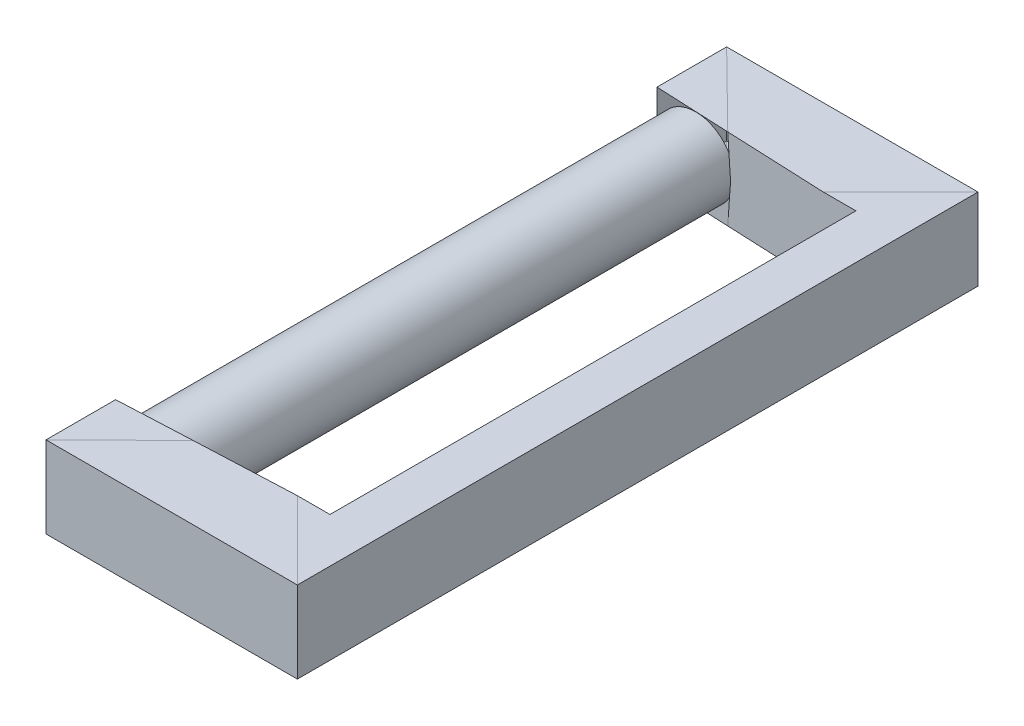
ISO-10303-21;
HEADER;
FILE_DESCRIPTION(('STEP AP214'),'2;1');
FILE_NAME('part.step','',(''),(''),'','','');
FILE_SCHEMA(('AUTOMOTIVE_DESIGN { 1 0 10303 214 1 1 1 1 }'));
ENDSEC;
DATA;
#1=APPLICATION_CONTEXT('core data for automotive mechanical design processes');
#2=APPLICATION_PROTOCOL_DEFINITION('international standard','automotive_design',2000,#1);
#3=PRODUCT_CONTEXT('',#1,'mechanical');
#4=PRODUCT('Part','Part','',(#3));
#5=PRODUCT_RELATED_PRODUCT_CATEGORY('part','',(#4));
#6=PRODUCT_DEFINITION_FORMATION('','',#4);
#7=PRODUCT_DEFINITION_CONTEXT('part definition',#1,'design');
#8=PRODUCT_DEFINITION('design','',#6,#7);
#9=PRODUCT_DEFINITION_SHAPE('','',#8);
#10=(LENGTH_UNIT() NAMED_UNIT(*) SI_UNIT(.MILLI.,.METRE.));
#11=(NAMED_UNIT(*) PLANE_ANGLE_UNIT() SI_UNIT($,.RADIAN.));
#12=(NAMED_UNIT(*) SI_UNIT($,.STERADIAN.) SOLID_ANGLE_UNIT());
#13=UNCERTAINTY_MEASURE_WITH_UNIT(LENGTH_MEASURE(1.E-05),#10,'distance_accuracy_value','');
#14=(GEOMETRIC_REPRESENTATION_CONTEXT(3) GLOBAL_UNCERTAINTY_ASSIGNED_CONTEXT((#13)) GLOBAL_UNIT_ASSIGNED_CONTEXT((#10,
#11,#12)) REPRESENTATION_CONTEXT('',''));
#15=CARTESIAN_POINT('',(0.,0.,0.));
#16=DIRECTION('',(0.,0.,1.));
#17=DIRECTION('',(1.,0.,0.));
#18=AXIS2_PLACEMENT_3D('',#15,#16,#17);
#19=CARTESIAN_POINT('',(0.,0.,3.5));
#20=DIRECTION('',(0.,0.,-1.));
#21=DIRECTION('',(-1.,0.,0.));
#22=AXIS2_PLACEMENT_3D('',#19,#20,#21);
#23=PLANE('',#22);
#24=CARTESIAN_POINT('',(0.,0.,3.5));
#25=DIRECTION('',(0.,0.,1.));
#26=DIRECTION('',(1.,0.,0.));
#27=AXIS2_PLACEMENT_3D('',#24,#25,#26);
#28=CIRCLE('',#27,0.5);
#29=CARTESIAN_POINT('',(0.5,0.,3.45));
#30=VERTEX_POINT('',#29);
#31=CARTESIAN_POINT('',(-0.5,0.,3.5));
#32=VERTEX_POINT('',#31);
#33=EDGE_CURVE('E11',#30,#32,#28,.T.);
#34=ORIENTED_EDGE('',*,*,#33,.T.);
#35=DIRECTION('',(0.,-1.,0.));
#36=VECTOR('',#35,1.);
#37=CARTESIAN_POINT('',(-0.5,-0.527056232971408,3.5));
#38=LINE('',#37,#36);
#39=CARTESIAN_POINT('',(-0.5,0.527056232971408,3.5));
#40=VERTEX_POINT('',#39);
#41=EDGE_CURVE('E231',#40,#32,#38,.T.);
#42=ORIENTED_EDGE('',*,*,#41,.F.);
#43=DIRECTION('',(-1.,0.,0.));
#44=VECTOR('',#43,1.);
#45=CARTESIAN_POINT('',(-0.5,0.527056232971408,3.5));
#46=LINE('',#45,#44);
#47=CARTESIAN_POINT('',(0.459053656464296,0.527056232971407,3.45570975765178));
#48=VERTEX_POINT('',#47);
#49=EDGE_CURVE('E243',#48,#40,#46,.T.);
#50=ORIENTED_EDGE('',*,*,#49,.F.);
#51=DIRECTION('',(0.,-1.,0.));
#52=VECTOR('',#51,1.);
#53=CARTESIAN_POINT('',(0.5,-0.527056232971408,3.4));
#54=LINE('',#53,#52);
#55=EDGE_CURVE('E37',#48,#30,#54,.T.);
#56=ORIENTED_EDGE('',*,*,#55,.T.);
#57=EDGE_LOOP('',(#34,#42,#50,#56));
#58=FACE_BOUND('',#57,.T.);
#59=ADVANCED_FACE('F33',(#58),#23,.T.);
#60=CARTESIAN_POINT('',(0.,0.,-3.5));
#61=DIRECTION('',(0.,0.,-1.));
#62=DIRECTION('',(-1.,0.,0.));
#63=AXIS2_PLACEMENT_3D('',#60,#61,#62);
#64=PLANE('',#63);
#65=DIRECTION('',(0.,-1.,0.));
#66=VECTOR('',#65,1.);
#67=CARTESIAN_POINT('',(-0.5,-0.527056232971408,-3.5));
#68=LINE('',#67,#66);
#69=CARTESIAN_POINT('',(-0.5,0.527056232971408,-3.5));
#70=VERTEX_POINT('',#69);
#71=CARTESIAN_POINT('',(-0.5,0.,-3.5));
#72=VERTEX_POINT('',#71);
#73=EDGE_CURVE('E182',#70,#72,#68,.T.);
#74=ORIENTED_EDGE('',*,*,#73,.T.);
#75=CARTESIAN_POINT('',(0.,0.,-3.5));
#76=DIRECTION('',(0.,0.,1.));
#77=DIRECTION('',(1.,0.,0.));
#78=AXIS2_PLACEMENT_3D('',#75,#76,#77);
#79=CIRCLE('',#78,0.5);
#80=CARTESIAN_POINT('',(0.5,0.,-3.45));
#81=VERTEX_POINT('',#80);
#82=EDGE_CURVE('E315',#81,#72,#79,.T.);
#83=ORIENTED_EDGE('',*,*,#82,.F.);
#84=DIRECTION('',(0.,-1.,0.));
#85=VECTOR('',#84,1.);
#86=CARTESIAN_POINT('',(0.5,-0.527056232971408,-3.4));
#87=LINE('',#86,#85);
#88=CARTESIAN_POINT('',(0.459053656464297,0.527056232971408,-3.45570975765178));
#89=VERTEX_POINT('',#88);
#90=EDGE_CURVE('E56',#89,#81,#87,.T.);
#91=ORIENTED_EDGE('',*,*,#90,.F.);
#92=DIRECTION('',(-1.,0.,0.));
#93=VECTOR('',#92,1.);
#94=CARTESIAN_POINT('',(-0.5,0.527056232971408,-3.5));
#95=LINE('',#94,#93);
#96=EDGE_CURVE('E190',#89,#70,#95,.T.);
#97=ORIENTED_EDGE('',*,*,#96,.T.);
#98=EDGE_LOOP('',(#74,#83,#91,#97));
#99=FACE_BOUND('',#98,.T.);
#100=ADVANCED_FACE('F413',(#99),#64,.F.);
#101=EDGE_CURVE('E43',#32,#30,#28,.T.);
#102=ORIENTED_EDGE('',*,*,#101,.T.);
#103=CARTESIAN_POINT('',(0.459053656464297,-0.527056232971408,3.45570975765178));
#104=VERTEX_POINT('',#103);
#105=EDGE_CURVE('E312',#30,#104,#54,.T.);
#106=ORIENTED_EDGE('',*,*,#105,.T.);
#107=DIRECTION('',(1.,0.,0.));
#108=VECTOR('',#107,1.);
#109=CARTESIAN_POINT('',(-0.5,-0.527056232971408,3.5));
#110=LINE('',#109,#108);
#111=CARTESIAN_POINT('',(-0.5,-0.527056232971408,3.5));
#112=VERTEX_POINT('',#111);
#113=EDGE_CURVE('E234',#112,#104,#110,.T.);
#114=ORIENTED_EDGE('',*,*,#113,.F.);
#115=EDGE_CURVE('E235',#32,#112,#38,.T.);
#116=ORIENTED_EDGE('',*,*,#115,.F.);
#117=EDGE_LOOP('',(#102,#106,#114,#116));
#118=FACE_BOUND('',#117,.T.);
#119=ADVANCED_FACE('F367',(#118),#23,.T.);
#120=CARTESIAN_POINT('',(0.459053656464297,-0.527056232971408,-3.45570975765178));
#121=VERTEX_POINT('',#120);
#122=EDGE_CURVE('E207',#81,#121,#87,.T.);
#123=ORIENTED_EDGE('',*,*,#122,.F.);
#124=EDGE_CURVE('E318',#72,#81,#79,.T.);
#125=ORIENTED_EDGE('',*,*,#124,.F.);
#126=CARTESIAN_POINT('',(-0.5,-0.527056232971408,-3.5));
#127=VERTEX_POINT('',#126);
#128=EDGE_CURVE('E185',#72,#127,#68,.T.);
#129=ORIENTED_EDGE('',*,*,#128,.T.);
#130=DIRECTION('',(1.,0.,0.));
#131=VECTOR('',#130,1.);
#132=CARTESIAN_POINT('',(-0.5,-0.527056232971408,-3.5));
#133=LINE('',#132,#131);
#134=EDGE_CURVE('E181',#127,#121,#133,.T.);
#135=ORIENTED_EDGE('',*,*,#134,.T.);
#136=EDGE_LOOP('',(#123,#125,#129,#135));
#137=FACE_BOUND('',#136,.T.);
#138=ADVANCED_FACE('F347',(#137),#64,.F.);
#139=CARTESIAN_POINT('',(-0.5,-0.527056232971408,4.55));
#140=DIRECTION('',(0.,1.,0.));
#141=DIRECTION('',(0.,0.,1.));
#142=AXIS2_PLACEMENT_3D('',#139,#140,#141);
#143=PLANE('',#142);
#144=DIRECTION('',(-0.707106781186547,0.,0.707106781186548));
#145=VECTOR('',#144,1.);
#146=CARTESIAN_POINT('',(1.2,-0.527056232971408,2.7));
#147=LINE('',#146,#145);
#148=CARTESIAN_POINT('',(-0.5,-0.527056232971408,4.4));
#149=VERTEX_POINT('',#148);
#150=EDGE_CURVE('E372',#104,#149,#147,.T.);
#151=ORIENTED_EDGE('',*,*,#150,.T.);
#152=DIRECTION('',(0.,0.,-1.));
#153=VECTOR('',#152,1.);
#154=CARTESIAN_POINT('',(-0.5,-0.527056232971408,4.55));
#155=LINE('',#154,#153);
#156=EDGE_CURVE('E166',#149,#112,#155,.T.);
#157=ORIENTED_EDGE('',*,*,#156,.T.);
#158=ORIENTED_EDGE('',*,*,#113,.T.);
#159=EDGE_LOOP('',(#151,#157,#158));
#160=FACE_BOUND('',#159,.T.);
#161=ADVANCED_FACE('F371',(#160),#143,.F.);
#162=CARTESIAN_POINT('',(-0.5,-0.527056232971408,4.55));
#163=DIRECTION('',(1.,0.,0.));
#164=DIRECTION('',(0.,0.,-1.));
#165=AXIS2_PLACEMENT_3D('',#162,#163,#164);
#166=PLANE('',#165);
#167=DIRECTION('',(0.,1.,0.));
#168=VECTOR('',#167,1.);
#169=CARTESIAN_POINT('',(-0.500000000000001,-0.527056232971408,4.4));
#170=LINE('',#169,#168);
#171=CARTESIAN_POINT('',(-0.5,0.527056232971408,4.4));
#172=VERTEX_POINT('',#171);
#173=EDGE_CURVE('E223',#149,#172,#170,.T.);
#174=ORIENTED_EDGE('',*,*,#173,.T.);
#175=DIRECTION('',(0.,0.,-1.));
#176=VECTOR('',#175,1.);
#177=CARTESIAN_POINT('',(-0.5,0.527056232971408,4.55));
#178=LINE('',#177,#176);
#179=EDGE_CURVE('E162',#172,#40,#178,.T.);
#180=ORIENTED_EDGE('',*,*,#179,.T.);
#181=ORIENTED_EDGE('',*,*,#41,.T.);
#182=ORIENTED_EDGE('',*,*,#115,.T.);
#183=ORIENTED_EDGE('',*,*,#156,.F.);
#184=EDGE_LOOP('',(#174,#180,#181,#182,#183));
#185=FACE_BOUND('',#184,.T.);
#186=ADVANCED_FACE('F399',(#185),#166,.F.);
#187=CARTESIAN_POINT('',(-0.5,0.527056232971408,4.55));
#188=DIRECTION('',(0.,-1.,0.));
#189=DIRECTION('',(0.,0.,-1.));
#190=AXIS2_PLACEMENT_3D('',#187,#188,#189);
#191=PLANE('',#190);
#192=DIRECTION('',(0.707106781186547,0.,-0.707106781186548));
#193=VECTOR('',#192,1.);
#194=CARTESIAN_POINT('',(1.2,0.527056232971408,2.7));
#195=LINE('',#194,#193);
#196=EDGE_CURVE('E218',#172,#48,#195,.T.);
#197=ORIENTED_EDGE('',*,*,#196,.T.);
#198=ORIENTED_EDGE('',*,*,#49,.T.);
#199=ORIENTED_EDGE('',*,*,#179,.F.);
#200=EDGE_LOOP('',(#197,#198,#199));
#201=FACE_BOUND('',#200,.T.);
#202=ADVANCED_FACE('F394',(#201),#191,.F.);
#203=CARTESIAN_POINT('',(2.9,-0.527056232971408,4.4));
#204=DIRECTION('',(0.,1.,0.));
#205=DIRECTION('',(0.,0.,1.));
#206=AXIS2_PLACEMENT_3D('',#203,#204,#205);
#207=PLANE('',#206);
#208=DIRECTION('',(-1.,0.,0.));
#209=VECTOR('',#208,1.);
#210=CARTESIAN_POINT('',(2.9,-0.527056232971408,3.4));
#211=LINE('',#210,#209);
#212=CARTESIAN_POINT('',(1.75,-0.527056232971408,3.4));
#213=VERTEX_POINT('',#212);
#214=EDGE_CURVE('E360',#213,#104,#211,.T.);
#215=ORIENTED_EDGE('',*,*,#214,.F.);
#216=DIRECTION('',(0.707106781186548,0.,0.707106781186547));
#217=VECTOR('',#216,1.);
#218=CARTESIAN_POINT('',(-1.725,-0.527056232971408,-0.0749999999999987));
#219=LINE('',#218,#217);
#220=CARTESIAN_POINT('',(2.75,-0.527056232971408,4.4));
#221=VERTEX_POINT('',#220);
#222=EDGE_CURVE('E211',#213,#221,#219,.T.);
#223=ORIENTED_EDGE('',*,*,#222,.T.);
#224=DIRECTION('',(-1.,0.,0.));
#225=VECTOR('',#224,1.);
#226=CARTESIAN_POINT('',(2.9,-0.527056232971408,4.4));
#227=LINE('',#226,#225);
#228=EDGE_CURVE('E375',#221,#149,#227,.T.);
#229=ORIENTED_EDGE('',*,*,#228,.T.);
#230=ORIENTED_EDGE('',*,*,#150,.F.);
#231=EDGE_LOOP('',(#215,#223,#229,#230));
#232=FACE_BOUND('',#231,.T.);
#233=ADVANCED_FACE('F378',(#232),#207,.F.);
#234=CARTESIAN_POINT('',(2.9,-0.527056232971408,4.4));
#235=DIRECTION('',(0.,0.,-1.));
#236=DIRECTION('',(-1.,0.,0.));
#237=AXIS2_PLACEMENT_3D('',#234,#235,#236);
#238=PLANE('',#237);
#239=ORIENTED_EDGE('',*,*,#228,.F.);
#240=DIRECTION('',(0.,1.,0.));
#241=VECTOR('',#240,1.);
#242=CARTESIAN_POINT('',(2.75,-0.527056232971408,4.4));
#243=LINE('',#242,#241);
#244=CARTESIAN_POINT('',(2.75,0.527056232971408,4.4));
#245=VERTEX_POINT('',#244);
#246=EDGE_CURVE('E208',#221,#245,#243,.T.);
#247=ORIENTED_EDGE('',*,*,#246,.T.);
#248=DIRECTION('',(-1.,0.,0.));
#249=VECTOR('',#248,1.);
#250=CARTESIAN_POINT('',(2.9,0.527056232971408,4.4));
#251=LINE('',#250,#249);
#252=EDGE_CURVE('E333',#245,#172,#251,.T.);
#253=ORIENTED_EDGE('',*,*,#252,.T.);
#254=ORIENTED_EDGE('',*,*,#173,.F.);
#255=EDGE_LOOP('',(#239,#247,#253,#254));
#256=FACE_BOUND('',#255,.T.);
#257=ADVANCED_FACE('F400',(#256),#238,.F.);
#258=CARTESIAN_POINT('',(2.9,0.527056232971408,4.4));
#259=DIRECTION('',(0.,-1.,0.));
#260=DIRECTION('',(0.,0.,-1.));
#261=AXIS2_PLACEMENT_3D('',#258,#259,#260);
#262=PLANE('',#261);
#263=ORIENTED_EDGE('',*,*,#252,.F.);
#264=DIRECTION('',(-0.707106781186548,0.,-0.707106781186547));
#265=VECTOR('',#264,1.);
#266=CARTESIAN_POINT('',(-1.725,0.527056232971408,-0.0749999999999987));
#267=LINE('',#266,#265);
#268=CARTESIAN_POINT('',(1.75,0.527056232971408,3.4));
#269=VERTEX_POINT('',#268);
#270=EDGE_CURVE('E205',#245,#269,#267,.T.);
#271=ORIENTED_EDGE('',*,*,#270,.T.);
#272=DIRECTION('',(-1.,0.,0.));
#273=VECTOR('',#272,1.);
#274=CARTESIAN_POINT('',(2.9,0.527056232971408,3.4));
#275=LINE('',#274,#273);
#276=EDGE_CURVE('E143',#269,#48,#275,.T.);
#277=ORIENTED_EDGE('',*,*,#276,.T.);
#278=ORIENTED_EDGE('',*,*,#196,.F.);
#279=EDGE_LOOP('',(#263,#271,#277,#278));
#280=FACE_BOUND('',#279,.T.);
#281=ADVANCED_FACE('F294',(#280),#262,.F.);
#282=CARTESIAN_POINT('',(2.9,-0.527056232971408,3.4));
#283=DIRECTION('',(0.,0.,1.));
#284=DIRECTION('',(1.,0.,0.));
#285=AXIS2_PLACEMENT_3D('',#282,#283,#284);
#286=PLANE('',#285);
#287=ORIENTED_EDGE('',*,*,#55,.F.);
#288=ORIENTED_EDGE('',*,*,#276,.F.);
#289=DIRECTION('',(-1.,0.,0.));
#290=VECTOR('',#289,1.);
#291=CARTESIAN_POINT('',(1.65,0.527056232971408,3.4));
#292=LINE('',#291,#290);
#293=CARTESIAN_POINT('',(2.17148402434886,0.527056232971408,3.4));
#294=VERTEX_POINT('',#293);
#295=EDGE_CURVE('E137',#294,#269,#292,.T.);
#296=ORIENTED_EDGE('',*,*,#295,.F.);
#297=DIRECTION('',(0.,1.,0.));
#298=VECTOR('',#297,1.);
#299=CARTESIAN_POINT('',(2.17148402434886,-0.527056232971408,3.4));
#300=LINE('',#299,#298);
#301=CARTESIAN_POINT('',(2.17148402434886,-0.527056232971408,3.4));
#302=VERTEX_POINT('',#301);
#303=EDGE_CURVE('E141',#302,#294,#300,.T.);
#304=ORIENTED_EDGE('',*,*,#303,.F.);
#305=DIRECTION('',(1.,0.,0.));
#306=VECTOR('',#305,1.);
#307=CARTESIAN_POINT('',(1.65,-0.527056232971408,3.4));
#308=LINE('',#307,#306);
#309=EDGE_CURVE('E157',#213,#302,#308,.T.);
#310=ORIENTED_EDGE('',*,*,#309,.F.);
#311=ORIENTED_EDGE('',*,*,#214,.T.);
#312=ORIENTED_EDGE('',*,*,#105,.F.);
#313=EDGE_LOOP('',(#287,#288,#296,#304,#310,#311,#312));
#314=FACE_BOUND('',#313,.T.);
#315=ADVANCED_FACE('F140',(#314),#286,.F.);
#316=CARTESIAN_POINT('',(2.75,-0.527056232971408,-4.55));
#317=DIRECTION('',(0.,1.,0.));
#318=DIRECTION('',(0.,0.,1.));
#319=AXIS2_PLACEMENT_3D('',#316,#317,#318);
#320=PLANE('',#319);
#321=DIRECTION('',(0.,0.,1.));
#322=VECTOR('',#321,1.);
#323=CARTESIAN_POINT('',(2.17148402434886,-0.527056232971408,-4.57605215807256));
#324=LINE('',#323,#322);
#325=CARTESIAN_POINT('',(2.17148402434886,-0.527056232971408,-3.4));
#326=VERTEX_POINT('',#325);
#327=EDGE_CURVE('E156',#326,#302,#324,.T.);
#328=ORIENTED_EDGE('',*,*,#327,.F.);
#329=DIRECTION('',(1.,0.,0.));
#330=VECTOR('',#329,1.);
#331=CARTESIAN_POINT('',(1.65,-0.527056232971408,-3.4));
#332=LINE('',#331,#330);
#333=CARTESIAN_POINT('',(1.75,-0.527056232971408,-3.4));
#334=VERTEX_POINT('',#333);
#335=EDGE_CURVE('E355',#334,#326,#332,.T.);
#336=ORIENTED_EDGE('',*,*,#335,.F.);
#337=DIRECTION('',(0.707106781186547,0.,-0.707106781186548));
#338=VECTOR('',#337,1.);
#339=CARTESIAN_POINT('',(1.05,-0.527056232971408,-2.7));
#340=LINE('',#339,#338);
#341=CARTESIAN_POINT('',(2.75,-0.527056232971408,-4.4));
#342=VERTEX_POINT('',#341);
#343=EDGE_CURVE('E194',#334,#342,#340,.T.);
#344=ORIENTED_EDGE('',*,*,#343,.T.);
#345=DIRECTION('',(0.,0.,1.));
#346=VECTOR('',#345,1.);
#347=CARTESIAN_POINT('',(2.75,-0.527056232971408,-4.55));
#348=LINE('',#347,#346);
#349=EDGE_CURVE('E215',#342,#221,#348,.T.);
#350=ORIENTED_EDGE('',*,*,#349,.T.);
#351=ORIENTED_EDGE('',*,*,#222,.F.);
#352=ORIENTED_EDGE('',*,*,#309,.T.);
#353=EDGE_LOOP('',(#328,#336,#344,#350,#351,#352));
#354=FACE_BOUND('',#353,.T.);
#355=ADVANCED_FACE('F286',(#354),#320,.F.);
#356=CARTESIAN_POINT('',(2.75,-0.527056232971408,-4.55));
#357=DIRECTION('',(-1.,0.,0.));
#358=DIRECTION('',(0.,0.,1.));
#359=AXIS2_PLACEMENT_3D('',#356,#357,#358);
#360=PLANE('',#359);
#361=ORIENTED_EDGE('',*,*,#349,.F.);
#362=DIRECTION('',(0.,1.,0.));
#363=VECTOR('',#362,1.);
#364=CARTESIAN_POINT('',(2.75,-0.527056232971408,-4.4));
#365=LINE('',#364,#363);
#366=CARTESIAN_POINT('',(2.75,0.527056232971408,-4.4));
#367=VERTEX_POINT('',#366);
#368=EDGE_CURVE('E191',#342,#367,#365,.T.);
#369=ORIENTED_EDGE('',*,*,#368,.T.);
#370=DIRECTION('',(0.,0.,1.));
#371=VECTOR('',#370,1.);
#372=CARTESIAN_POINT('',(2.75,0.527056232971408,-4.55));
#373=LINE('',#372,#371);
#374=EDGE_CURVE('E214',#367,#245,#373,.T.);
#375=ORIENTED_EDGE('',*,*,#374,.T.);
#376=ORIENTED_EDGE('',*,*,#246,.F.);
#377=EDGE_LOOP('',(#361,#369,#375,#376));
#378=FACE_BOUND('',#377,.T.);
#379=ADVANCED_FACE('F283',(#378),#360,.F.);
#380=CARTESIAN_POINT('',(2.75,0.527056232971408,-4.55));
#381=DIRECTION('',(0.,-1.,0.));
#382=DIRECTION('',(0.,0.,-1.));
#383=AXIS2_PLACEMENT_3D('',#380,#381,#382);
#384=PLANE('',#383);
#385=DIRECTION('',(-0.707106781186547,0.,0.707106781186548));
#386=VECTOR('',#385,1.);
#387=CARTESIAN_POINT('',(1.05,0.527056232971408,-2.7));
#388=LINE('',#387,#386);
#389=CARTESIAN_POINT('',(1.75,0.527056232971408,-3.4));
#390=VERTEX_POINT('',#389);
#391=EDGE_CURVE('E188',#367,#390,#388,.T.);
#392=ORIENTED_EDGE('',*,*,#391,.T.);
#393=DIRECTION('',(-1.,0.,0.));
#394=VECTOR('',#393,1.);
#395=CARTESIAN_POINT('',(1.65,0.527056232971408,-3.4));
#396=LINE('',#395,#394);
#397=CARTESIAN_POINT('',(2.17148402434886,0.527056232971408,-3.4));
#398=VERTEX_POINT('',#397);
#399=EDGE_CURVE('E147',#398,#390,#396,.T.);
#400=ORIENTED_EDGE('',*,*,#399,.F.);
#401=DIRECTION('',(0.,0.,1.));
#402=VECTOR('',#401,1.);
#403=CARTESIAN_POINT('',(2.17148402434886,0.527056232971408,-4.57605215807256));
#404=LINE('',#403,#402);
#405=EDGE_CURVE('E153',#398,#294,#404,.T.);
#406=ORIENTED_EDGE('',*,*,#405,.T.);
#407=ORIENTED_EDGE('',*,*,#295,.T.);
#408=ORIENTED_EDGE('',*,*,#270,.F.);
#409=ORIENTED_EDGE('',*,*,#374,.F.);
#410=EDGE_LOOP('',(#392,#400,#406,#407,#408,#409));
#411=FACE_BOUND('',#410,.T.);
#412=ADVANCED_FACE('F160',(#411),#384,.F.);
#413=CARTESIAN_POINT('',(-0.65,-0.527056232971408,-4.4));
#414=DIRECTION('',(0.,1.,0.));
#415=DIRECTION('',(0.,0.,1.));
#416=AXIS2_PLACEMENT_3D('',#413,#414,#415);
#417=PLANE('',#416);
#418=DIRECTION('',(1.,0.,0.));
#419=VECTOR('',#418,1.);
#420=CARTESIAN_POINT('',(-0.65,-0.527056232971408,-3.4));
#421=LINE('',#420,#419);
#422=EDGE_CURVE('E197',#121,#334,#421,.T.);
#423=ORIENTED_EDGE('',*,*,#422,.F.);
#424=DIRECTION('',(-0.707106781186548,0.,-0.707106781186548));
#425=VECTOR('',#424,1.);
#426=CARTESIAN_POINT('',(-0.05,-0.527056232971408,-3.95));
#427=LINE('',#426,#425);
#428=CARTESIAN_POINT('',(-0.5,-0.527056232971408,-4.4));
#429=VERTEX_POINT('',#428);
#430=EDGE_CURVE('E175',#121,#429,#427,.T.);
#431=ORIENTED_EDGE('',*,*,#430,.T.);
#432=DIRECTION('',(1.,0.,0.));
#433=VECTOR('',#432,1.);
#434=CARTESIAN_POINT('',(-0.65,-0.527056232971408,-4.4));
#435=LINE('',#434,#433);
#436=EDGE_CURVE('E198',#429,#342,#435,.T.);
#437=ORIENTED_EDGE('',*,*,#436,.T.);
#438=ORIENTED_EDGE('',*,*,#343,.F.);
#439=EDGE_LOOP('',(#423,#431,#437,#438));
#440=FACE_BOUND('',#439,.T.);
#441=ADVANCED_FACE('F276',(#440),#417,.F.);
#442=CARTESIAN_POINT('',(-0.65,-0.527056232971408,-4.4));
#443=DIRECTION('',(0.,0.,1.));
#444=DIRECTION('',(1.,0.,0.));
#445=AXIS2_PLACEMENT_3D('',#442,#443,#444);
#446=PLANE('',#445);
#447=ORIENTED_EDGE('',*,*,#436,.F.);
#448=DIRECTION('',(0.,1.,0.));
#449=VECTOR('',#448,1.);
#450=CARTESIAN_POINT('',(-0.5,-0.527056232971408,-4.4));
#451=LINE('',#450,#449);
#452=CARTESIAN_POINT('',(-0.5,0.527056232971408,-4.4));
#453=VERTEX_POINT('',#452);
#454=EDGE_CURVE('E172',#429,#453,#451,.T.);
#455=ORIENTED_EDGE('',*,*,#454,.T.);
#456=DIRECTION('',(1.,0.,0.));
#457=VECTOR('',#456,1.);
#458=CARTESIAN_POINT('',(-0.65,0.527056232971408,-4.4));
#459=LINE('',#458,#457);
#460=EDGE_CURVE('E201',#453,#367,#459,.T.);
#461=ORIENTED_EDGE('',*,*,#460,.T.);
#462=ORIENTED_EDGE('',*,*,#368,.F.);
#463=EDGE_LOOP('',(#447,#455,#461,#462));
#464=FACE_BOUND('',#463,.T.);
#465=ADVANCED_FACE('F272',(#464),#446,.F.);
#466=CARTESIAN_POINT('',(-0.65,0.527056232971408,-4.4));
#467=DIRECTION('',(0.,-1.,0.));
#468=DIRECTION('',(0.,0.,-1.));
#469=AXIS2_PLACEMENT_3D('',#466,#467,#468);
#470=PLANE('',#469);
#471=ORIENTED_EDGE('',*,*,#460,.F.);
#472=DIRECTION('',(0.707106781186548,0.,0.707106781186548));
#473=VECTOR('',#472,1.);
#474=CARTESIAN_POINT('',(-0.05,0.527056232971408,-3.95));
#475=LINE('',#474,#473);
#476=EDGE_CURVE('E176',#453,#89,#475,.T.);
#477=ORIENTED_EDGE('',*,*,#476,.T.);
#478=DIRECTION('',(1.,0.,0.));
#479=VECTOR('',#478,1.);
#480=CARTESIAN_POINT('',(-0.65,0.527056232971408,-3.4));
#481=LINE('',#480,#479);
#482=EDGE_CURVE('E204',#89,#390,#481,.T.);
#483=ORIENTED_EDGE('',*,*,#482,.T.);
#484=ORIENTED_EDGE('',*,*,#391,.F.);
#485=EDGE_LOOP('',(#471,#477,#483,#484));
#486=FACE_BOUND('',#485,.T.);
#487=ADVANCED_FACE('F268',(#486),#470,.F.);
#488=CARTESIAN_POINT('',(-0.65,-0.527056232971408,-3.4));
#489=DIRECTION('',(0.,0.,-1.));
#490=DIRECTION('',(-1.,0.,0.));
#491=AXIS2_PLACEMENT_3D('',#488,#489,#490);
#492=PLANE('',#491);
#493=ORIENTED_EDGE('',*,*,#422,.T.);
#494=ORIENTED_EDGE('',*,*,#335,.T.);
#495=DIRECTION('',(0.,1.,0.));
#496=VECTOR('',#495,1.);
#497=CARTESIAN_POINT('',(2.17148402434886,-0.527056232971408,-3.4));
#498=LINE('',#497,#496);
#499=EDGE_CURVE('E163',#326,#398,#498,.T.);
#500=ORIENTED_EDGE('',*,*,#499,.T.);
#501=ORIENTED_EDGE('',*,*,#399,.T.);
#502=ORIENTED_EDGE('',*,*,#482,.F.);
#503=ORIENTED_EDGE('',*,*,#90,.T.);
#504=ORIENTED_EDGE('',*,*,#122,.T.);
#505=EDGE_LOOP('',(#493,#494,#500,#501,#502,#503,#504));
#506=FACE_BOUND('',#505,.T.);
#507=ADVANCED_FACE('F257',(#506),#492,.F.);
#508=CARTESIAN_POINT('',(-0.5,-0.527056232971408,-3.5));
#509=DIRECTION('',(0.,1.,0.));
#510=DIRECTION('',(0.,0.,1.));
#511=AXIS2_PLACEMENT_3D('',#508,#509,#510);
#512=PLANE('',#511);
#513=ORIENTED_EDGE('',*,*,#134,.F.);
#514=DIRECTION('',(0.,0.,-1.));
#515=VECTOR('',#514,1.);
#516=CARTESIAN_POINT('',(-0.5,-0.527056232971408,-3.5));
#517=LINE('',#516,#515);
#518=EDGE_CURVE('E180',#127,#429,#517,.T.);
#519=ORIENTED_EDGE('',*,*,#518,.T.);
#520=ORIENTED_EDGE('',*,*,#430,.F.);
#521=EDGE_LOOP('',(#513,#519,#520));
#522=FACE_BOUND('',#521,.T.);
#523=ADVANCED_FACE('F267',(#522),#512,.F.);
#524=CARTESIAN_POINT('',(-0.5,-0.527056232971408,-3.5));
#525=DIRECTION('',(1.,0.,0.));
#526=DIRECTION('',(0.,0.,-1.));
#527=AXIS2_PLACEMENT_3D('',#524,#525,#526);
#528=PLANE('',#527);
#529=ORIENTED_EDGE('',*,*,#518,.F.);
#530=ORIENTED_EDGE('',*,*,#128,.F.);
#531=ORIENTED_EDGE('',*,*,#73,.F.);
#532=DIRECTION('',(0.,0.,-1.));
#533=VECTOR('',#532,1.);
#534=CARTESIAN_POINT('',(-0.5,0.527056232971408,-3.5));
#535=LINE('',#534,#533);
#536=EDGE_CURVE('E177',#70,#453,#535,.T.);
#537=ORIENTED_EDGE('',*,*,#536,.T.);
#538=ORIENTED_EDGE('',*,*,#454,.F.);
#539=EDGE_LOOP('',(#529,#530,#531,#537,#538));
#540=FACE_BOUND('',#539,.T.);
#541=ADVANCED_FACE('F441',(#540),#528,.F.);
#542=CARTESIAN_POINT('',(-0.5,0.527056232971408,-3.5));
#543=DIRECTION('',(0.,-1.,0.));
#544=DIRECTION('',(0.,0.,-1.));
#545=AXIS2_PLACEMENT_3D('',#542,#543,#544);
#546=PLANE('',#545);
#547=ORIENTED_EDGE('',*,*,#536,.F.);
#548=ORIENTED_EDGE('',*,*,#96,.F.);
#549=ORIENTED_EDGE('',*,*,#476,.F.);
#550=EDGE_LOOP('',(#547,#548,#549));
#551=FACE_BOUND('',#550,.T.);
#552=ADVANCED_FACE('F409',(#551),#546,.F.);
#553=CARTESIAN_POINT('',(0.,0.,3.5));
#554=DIRECTION('',(0.,0.,-1.));
#555=DIRECTION('',(-1.,0.,0.));
#556=AXIS2_PLACEMENT_3D('',#553,#554,#555);
#557=CYLINDRICAL_SURFACE('',#556,0.5);
#558=ORIENTED_EDGE('',*,*,#33,.F.);
#559=ORIENTED_EDGE('',*,*,#101,.F.);
#560=EDGE_LOOP('',(#558,#559));
#561=FACE_BOUND('',#560,.T.);
#562=ORIENTED_EDGE('',*,*,#82,.T.);
#563=ORIENTED_EDGE('',*,*,#124,.T.);
#564=EDGE_LOOP('',(#562,#563));
#565=FACE_BOUND('',#564,.T.);
#566=ADVANCED_FACE('F35',(#561,#565),#557,.T.);
#567=CARTESIAN_POINT('',(2.17148402434886,-0.527056232971408,-4.57605215807256));
#568=DIRECTION('',(1.,0.,0.));
#569=DIRECTION('',(0.,0.,-1.));
#570=AXIS2_PLACEMENT_3D('',#567,#568,#569);
#571=PLANE('',#570);
#572=ORIENTED_EDGE('',*,*,#327,.T.);
#573=ORIENTED_EDGE('',*,*,#303,.T.);
#574=ORIENTED_EDGE('',*,*,#405,.F.);
#575=ORIENTED_EDGE('',*,*,#499,.F.);
#576=EDGE_LOOP('',(#572,#573,#574,#575));
#577=FACE_BOUND('',#576,.T.);
#578=ADVANCED_FACE('F151',(#577),#571,.F.);
#579=CLOSED_SHELL('',(#59,#100,#119,#138,#161,#186,#202,#233,#257,#281,#315,#355,#379,#412,#441,
#465,#487,#507,#523,#541,#552,#566,#578));
#580=MANIFOLD_SOLID_BREP('B2',#579);
#581=ADVANCED_BREP_SHAPE_REPRESENTATION('',(#18,#580),#14);
#582=SHAPE_DEFINITION_REPRESENTATION(#9,#581);
ENDSEC;
END-ISO-10303-21;
